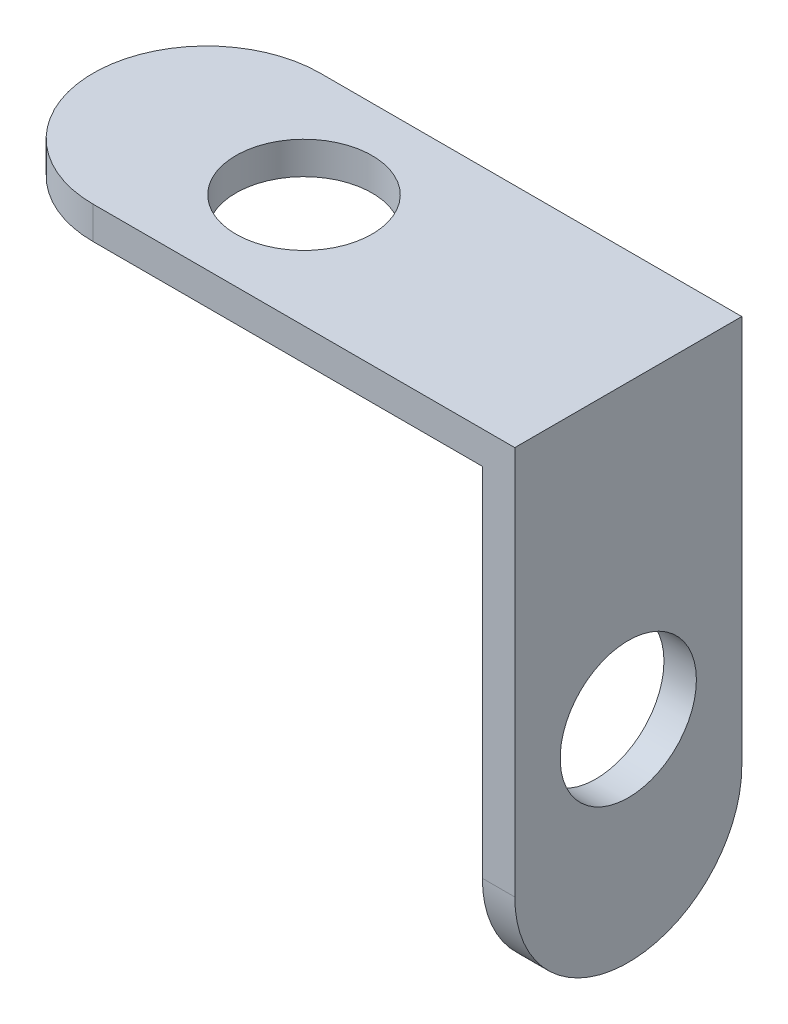
ISO-10303-21;
HEADER;
FILE_DESCRIPTION(('STEP AP214'),'2;1');
FILE_NAME('part.step','',(''),(''),'','','');
FILE_SCHEMA(('AUTOMOTIVE_DESIGN { 1 0 10303 214 1 1 1 1 }'));
ENDSEC;
DATA;
#1=APPLICATION_CONTEXT('core data for automotive mechanical design processes');
#2=APPLICATION_PROTOCOL_DEFINITION('international standard','automotive_design',2000,#1);
#3=PRODUCT_CONTEXT('',#1,'mechanical');
#4=PRODUCT('Part','Part','',(#3));
#5=PRODUCT_RELATED_PRODUCT_CATEGORY('part','',(#4));
#6=PRODUCT_DEFINITION_FORMATION('','',#4);
#7=PRODUCT_DEFINITION_CONTEXT('part definition',#1,'design');
#8=PRODUCT_DEFINITION('design','',#6,#7);
#9=PRODUCT_DEFINITION_SHAPE('','',#8);
#10=(LENGTH_UNIT() NAMED_UNIT(*) SI_UNIT(.MILLI.,.METRE.));
#11=(NAMED_UNIT(*) PLANE_ANGLE_UNIT() SI_UNIT($,.RADIAN.));
#12=(NAMED_UNIT(*) SI_UNIT($,.STERADIAN.) SOLID_ANGLE_UNIT());
#13=UNCERTAINTY_MEASURE_WITH_UNIT(LENGTH_MEASURE(1.E-05),#10,'distance_accuracy_value','');
#14=(GEOMETRIC_REPRESENTATION_CONTEXT(3) GLOBAL_UNCERTAINTY_ASSIGNED_CONTEXT((#13)) GLOBAL_UNIT_ASSIGNED_CONTEXT((#10,
#11,#12)) REPRESENTATION_CONTEXT('',''));
#15=CARTESIAN_POINT('',(0.,0.,0.));
#16=DIRECTION('',(0.,0.,1.));
#17=DIRECTION('',(1.,0.,0.));
#18=AXIS2_PLACEMENT_3D('',#15,#16,#17);
#19=CARTESIAN_POINT('',(-2.66159827333255,-0.911598273332554,3.49999999999999));
#20=DIRECTION('',(0.,1.,0.));
#21=DIRECTION('',(0.,0.,1.));
#22=AXIS2_PLACEMENT_3D('',#19,#20,#21);
#23=PLANE('',#22);
#24=DIRECTION('',(1.,0.,0.));
#25=VECTOR('',#24,1.);
#26=CARTESIAN_POINT('',(0.838401726667447,-0.911598273332554,5.24999999999999));
#27=LINE('',#26,#25);
#28=CARTESIAN_POINT('',(-2.66159827333255,-0.911598273332554,5.24999999999999));
#29=VERTEX_POINT('',#28);
#30=CARTESIAN_POINT('',(3.83840172666745,-0.911598273332561,5.24999999999999));
#31=VERTEX_POINT('',#30);
#32=EDGE_CURVE('E75',#29,#31,#27,.T.);
#33=ORIENTED_EDGE('',*,*,#32,.T.);
#34=DIRECTION('',(0.,0.,1.));
#35=VECTOR('',#34,1.);
#36=CARTESIAN_POINT('',(3.83840172666745,-0.911598273332548,1.74999999999999));
#37=LINE('',#36,#35);
#38=CARTESIAN_POINT('',(3.83840172666745,-0.911598273332548,1.74999999999999));
#39=VERTEX_POINT('',#38);
#40=EDGE_CURVE('E135',#39,#31,#37,.T.);
#41=ORIENTED_EDGE('',*,*,#40,.F.);
#42=DIRECTION('',(1.,0.,0.));
#43=VECTOR('',#42,1.);
#44=CARTESIAN_POINT('',(0.838401726667447,-0.911598273332554,1.74999999999999));
#45=LINE('',#44,#43);
#46=CARTESIAN_POINT('',(-2.66159827333255,-0.911598273332554,1.74999999999999));
#47=VERTEX_POINT('',#46);
#48=EDGE_CURVE('E112',#47,#39,#45,.T.);
#49=ORIENTED_EDGE('',*,*,#48,.F.);
#50=CARTESIAN_POINT('',(-2.66159827333255,-0.911598273332554,3.49999999999999));
#51=DIRECTION('',(0.,1.,0.));
#52=DIRECTION('',(0.,0.,1.));
#53=AXIS2_PLACEMENT_3D('',#50,#51,#52);
#54=CIRCLE('',#53,1.75);
#55=EDGE_CURVE('E101',#47,#29,#54,.T.);
#56=ORIENTED_EDGE('',*,*,#55,.T.);
#57=EDGE_LOOP('',(#33,#41,#49,#56));
#58=FACE_BOUND('',#57,.T.);
#59=CARTESIAN_POINT('',(-1.16159827333255,-0.911598273332554,3.49999999999999));
#60=DIRECTION('',(0.,1.,0.));
#61=DIRECTION('',(0.,0.,1.));
#62=AXIS2_PLACEMENT_3D('',#59,#60,#61);
#63=CIRCLE('',#62,1.05);
#64=CARTESIAN_POINT('',(-1.16159827333255,-0.911598273332554,4.54999999999999));
#65=VERTEX_POINT('',#64);
#66=EDGE_CURVE('E117',#65,#65,#63,.T.);
#67=ORIENTED_EDGE('',*,*,#66,.F.);
#68=EDGE_LOOP('',(#67));
#69=FACE_BOUND('',#68,.T.);
#70=ADVANCED_FACE('F58',(#58,#69),#23,.T.);
#71=CARTESIAN_POINT('',(-2.66159827333255,-1.41159827333255,3.49999999999999));
#72=DIRECTION('',(0.,1.,0.));
#73=DIRECTION('',(0.,0.,1.));
#74=AXIS2_PLACEMENT_3D('',#71,#72,#73);
#75=PLANE('',#74);
#76=DIRECTION('',(0.,0.,1.));
#77=VECTOR('',#76,1.);
#78=CARTESIAN_POINT('',(3.33840172666745,-1.41159827333255,1.74999999999999));
#79=LINE('',#78,#77);
#80=CARTESIAN_POINT('',(3.33840172666745,-1.41159827333255,1.74999999999999));
#81=VERTEX_POINT('',#80);
#82=CARTESIAN_POINT('',(3.33840172666745,-1.41159827333255,5.24999999999999));
#83=VERTEX_POINT('',#82);
#84=EDGE_CURVE('E110',#81,#83,#79,.T.);
#85=ORIENTED_EDGE('',*,*,#84,.T.);
#86=DIRECTION('',(-1.,0.,0.));
#87=VECTOR('',#86,1.);
#88=CARTESIAN_POINT('',(0.838401726667447,-1.41159827333255,5.24999999999999));
#89=LINE('',#88,#87);
#90=CARTESIAN_POINT('',(-2.66159827333255,-1.41159827333255,5.24999999999999));
#91=VERTEX_POINT('',#90);
#92=EDGE_CURVE('E97',#83,#91,#89,.T.);
#93=ORIENTED_EDGE('',*,*,#92,.T.);
#94=CARTESIAN_POINT('',(-2.66159827333255,-1.41159827333255,3.49999999999999));
#95=DIRECTION('',(0.,1.,0.));
#96=DIRECTION('',(0.,0.,1.));
#97=AXIS2_PLACEMENT_3D('',#94,#95,#96);
#98=CIRCLE('',#97,1.75);
#99=CARTESIAN_POINT('',(-2.66159827333255,-1.41159827333255,1.74999999999999));
#100=VERTEX_POINT('',#99);
#101=EDGE_CURVE('E103',#100,#91,#98,.T.);
#102=ORIENTED_EDGE('',*,*,#101,.F.);
#103=DIRECTION('',(-1.,0.,0.));
#104=VECTOR('',#103,1.);
#105=CARTESIAN_POINT('',(0.838401726667447,-1.41159827333255,1.74999999999999));
#106=LINE('',#105,#104);
#107=EDGE_CURVE('E90',#81,#100,#106,.T.);
#108=ORIENTED_EDGE('',*,*,#107,.F.);
#109=EDGE_LOOP('',(#85,#93,#102,#108));
#110=FACE_BOUND('',#109,.T.);
#111=CARTESIAN_POINT('',(-1.16159827333255,-1.41159827333255,3.49999999999999));
#112=DIRECTION('',(0.,1.,0.));
#113=DIRECTION('',(0.,0.,1.));
#114=AXIS2_PLACEMENT_3D('',#111,#112,#113);
#115=CIRCLE('',#114,1.05);
#116=CARTESIAN_POINT('',(-1.16159827333255,-1.41159827333255,4.54999999999999));
#117=VERTEX_POINT('',#116);
#118=EDGE_CURVE('E121',#117,#117,#115,.T.);
#119=ORIENTED_EDGE('',*,*,#118,.T.);
#120=EDGE_LOOP('',(#119));
#121=FACE_BOUND('',#120,.T.);
#122=ADVANCED_FACE('F107',(#110,#121),#75,.F.);
#123=CARTESIAN_POINT('',(0.838401726667447,-0.911598273332554,1.74999999999999));
#124=DIRECTION('',(0.,0.,1.));
#125=DIRECTION('',(1.,0.,0.));
#126=AXIS2_PLACEMENT_3D('',#123,#124,#125);
#127=PLANE('',#126);
#128=ORIENTED_EDGE('',*,*,#107,.T.);
#129=DIRECTION('',(0.,-1.,0.));
#130=VECTOR('',#129,1.);
#131=CARTESIAN_POINT('',(-2.66159827333255,-0.911598273332554,1.74999999999999));
#132=LINE('',#131,#130);
#133=EDGE_CURVE('E12',#47,#100,#132,.T.);
#134=ORIENTED_EDGE('',*,*,#133,.F.);
#135=ORIENTED_EDGE('',*,*,#48,.T.);
#136=DIRECTION('',(0.,1.,0.));
#137=VECTOR('',#136,1.);
#138=CARTESIAN_POINT('',(3.83840172666745,-6.91159827333255,1.74999999999997));
#139=LINE('',#138,#137);
#140=CARTESIAN_POINT('',(3.83840172666745,-6.91159827333255,1.74999999999997));
#141=VERTEX_POINT('',#140);
#142=EDGE_CURVE('E132',#141,#39,#139,.T.);
#143=ORIENTED_EDGE('',*,*,#142,.F.);
#144=DIRECTION('',(-1.,0.,0.));
#145=VECTOR('',#144,1.);
#146=CARTESIAN_POINT('',(3.83840172666745,-6.91159827333255,1.74999999999997));
#147=LINE('',#146,#145);
#148=CARTESIAN_POINT('',(3.33840172666745,-6.91159827333255,1.74999999999997));
#149=VERTEX_POINT('',#148);
#150=EDGE_CURVE('E129',#141,#149,#147,.T.);
#151=ORIENTED_EDGE('',*,*,#150,.T.);
#152=DIRECTION('',(0.,1.,0.));
#153=VECTOR('',#152,1.);
#154=CARTESIAN_POINT('',(3.33840172666745,-6.91159827333255,1.74999999999997));
#155=LINE('',#154,#153);
#156=EDGE_CURVE('E133',#149,#81,#155,.T.);
#157=ORIENTED_EDGE('',*,*,#156,.T.);
#158=EDGE_LOOP('',(#128,#134,#135,#143,#151,#157));
#159=FACE_BOUND('',#158,.T.);
#160=ADVANCED_FACE('F60',(#159),#127,.F.);
#161=CARTESIAN_POINT('',(-2.66159827333255,-0.911598273332554,3.49999999999999));
#162=DIRECTION('',(0.,-1.,0.));
#163=DIRECTION('',(0.,0.,-1.));
#164=AXIS2_PLACEMENT_3D('',#161,#162,#163);
#165=CYLINDRICAL_SURFACE('',#164,1.75);
#166=ORIENTED_EDGE('',*,*,#101,.T.);
#167=DIRECTION('',(0.,-1.,0.));
#168=VECTOR('',#167,1.);
#169=CARTESIAN_POINT('',(-2.66159827333255,-0.911598273332554,5.24999999999999));
#170=LINE('',#169,#168);
#171=EDGE_CURVE('E67',#29,#91,#170,.T.);
#172=ORIENTED_EDGE('',*,*,#171,.F.);
#173=ORIENTED_EDGE('',*,*,#55,.F.);
#174=ORIENTED_EDGE('',*,*,#133,.T.);
#175=EDGE_LOOP('',(#166,#172,#173,#174));
#176=FACE_BOUND('',#175,.T.);
#177=ADVANCED_FACE('F104',(#176),#165,.T.);
#178=CARTESIAN_POINT('',(0.838401726667447,-0.911598273332554,5.24999999999999));
#179=DIRECTION('',(0.,0.,1.));
#180=DIRECTION('',(1.,0.,0.));
#181=AXIS2_PLACEMENT_3D('',#178,#179,#180);
#182=PLANE('',#181);
#183=ORIENTED_EDGE('',*,*,#92,.F.);
#184=DIRECTION('',(0.,-1.,0.));
#185=VECTOR('',#184,1.);
#186=CARTESIAN_POINT('',(3.33840172666745,-6.91159827333256,5.24999999999997));
#187=LINE('',#186,#185);
#188=CARTESIAN_POINT('',(3.33840172666745,-6.91159827333256,5.24999999999997));
#189=VERTEX_POINT('',#188);
#190=EDGE_CURVE('E139',#83,#189,#187,.T.);
#191=ORIENTED_EDGE('',*,*,#190,.T.);
#192=DIRECTION('',(-1.,0.,0.));
#193=VECTOR('',#192,1.);
#194=CARTESIAN_POINT('',(3.83840172666745,-6.91159827333256,5.24999999999997));
#195=LINE('',#194,#193);
#196=CARTESIAN_POINT('',(3.83840172666745,-6.91159827333256,5.24999999999997));
#197=VERTEX_POINT('',#196);
#198=EDGE_CURVE('E124',#197,#189,#195,.T.);
#199=ORIENTED_EDGE('',*,*,#198,.F.);
#200=DIRECTION('',(0.,-1.,0.));
#201=VECTOR('',#200,1.);
#202=CARTESIAN_POINT('',(3.83840172666745,-6.91159827333256,5.24999999999997));
#203=LINE('',#202,#201);
#204=EDGE_CURVE('E147',#31,#197,#203,.T.);
#205=ORIENTED_EDGE('',*,*,#204,.F.);
#206=ORIENTED_EDGE('',*,*,#32,.F.);
#207=ORIENTED_EDGE('',*,*,#171,.T.);
#208=EDGE_LOOP('',(#183,#191,#199,#205,#206,#207));
#209=FACE_BOUND('',#208,.T.);
#210=ADVANCED_FACE('F94',(#209),#182,.T.);
#211=CARTESIAN_POINT('',(-1.16159827333255,-0.911598273332554,3.49999999999999));
#212=DIRECTION('',(0.,-1.,0.));
#213=DIRECTION('',(0.,0.,-1.));
#214=AXIS2_PLACEMENT_3D('',#211,#212,#213);
#215=CYLINDRICAL_SURFACE('',#214,1.05);
#216=ORIENTED_EDGE('',*,*,#66,.T.);
#217=EDGE_LOOP('',(#216));
#218=FACE_BOUND('',#217,.T.);
#219=ORIENTED_EDGE('',*,*,#118,.F.);
#220=EDGE_LOOP('',(#219));
#221=FACE_BOUND('',#220,.T.);
#222=ADVANCED_FACE('F164',(#218,#221),#215,.F.);
#223=CARTESIAN_POINT('',(3.83840172666745,-6.91159827333255,3.49999999999997));
#224=DIRECTION('',(1.,0.,0.));
#225=DIRECTION('',(0.,0.,-1.));
#226=AXIS2_PLACEMENT_3D('',#223,#224,#225);
#227=PLANE('',#226);
#228=ORIENTED_EDGE('',*,*,#40,.T.);
#229=ORIENTED_EDGE('',*,*,#204,.T.);
#230=CARTESIAN_POINT('',(3.83840172666745,-6.91159827333255,3.49999999999997));
#231=DIRECTION('',(1.,0.,0.));
#232=DIRECTION('',(0.,0.,-1.));
#233=AXIS2_PLACEMENT_3D('',#230,#231,#232);
#234=CIRCLE('',#233,1.75);
#235=EDGE_CURVE('E144',#197,#141,#234,.T.);
#236=ORIENTED_EDGE('',*,*,#235,.T.);
#237=ORIENTED_EDGE('',*,*,#142,.T.);
#238=EDGE_LOOP('',(#228,#229,#236,#237));
#239=FACE_BOUND('',#238,.T.);
#240=CARTESIAN_POINT('',(3.83840172666745,-5.41159827333255,3.49999999999998));
#241=DIRECTION('',(1.,0.,0.));
#242=DIRECTION('',(0.,0.,-1.));
#243=AXIS2_PLACEMENT_3D('',#240,#241,#242);
#244=CIRCLE('',#243,1.05);
#245=CARTESIAN_POINT('',(3.83840172666745,-5.41159827333255,2.44999999999998));
#246=VERTEX_POINT('',#245);
#247=EDGE_CURVE('E141',#246,#246,#244,.T.);
#248=ORIENTED_EDGE('',*,*,#247,.F.);
#249=EDGE_LOOP('',(#248));
#250=FACE_BOUND('',#249,.T.);
#251=ADVANCED_FACE('F161',(#239,#250),#227,.T.);
#252=CARTESIAN_POINT('',(3.33840172666745,-6.91159827333255,3.49999999999997));
#253=DIRECTION('',(1.,0.,0.));
#254=DIRECTION('',(0.,0.,-1.));
#255=AXIS2_PLACEMENT_3D('',#252,#253,#254);
#256=PLANE('',#255);
#257=ORIENTED_EDGE('',*,*,#84,.F.);
#258=ORIENTED_EDGE('',*,*,#156,.F.);
#259=CARTESIAN_POINT('',(3.33840172666745,-6.91159827333255,3.49999999999997));
#260=DIRECTION('',(1.,0.,0.));
#261=DIRECTION('',(0.,0.,-1.));
#262=AXIS2_PLACEMENT_3D('',#259,#260,#261);
#263=CIRCLE('',#262,1.75);
#264=EDGE_CURVE('E136',#189,#149,#263,.T.);
#265=ORIENTED_EDGE('',*,*,#264,.F.);
#266=ORIENTED_EDGE('',*,*,#190,.F.);
#267=EDGE_LOOP('',(#257,#258,#265,#266));
#268=FACE_BOUND('',#267,.T.);
#269=CARTESIAN_POINT('',(3.33840172666745,-5.41159827333255,3.49999999999998));
#270=DIRECTION('',(1.,0.,0.));
#271=DIRECTION('',(0.,0.,-1.));
#272=AXIS2_PLACEMENT_3D('',#269,#270,#271);
#273=CIRCLE('',#272,1.05);
#274=CARTESIAN_POINT('',(3.33840172666745,-5.41159827333255,2.44999999999998));
#275=VERTEX_POINT('',#274);
#276=EDGE_CURVE('E152',#275,#275,#273,.T.);
#277=ORIENTED_EDGE('',*,*,#276,.T.);
#278=EDGE_LOOP('',(#277));
#279=FACE_BOUND('',#278,.T.);
#280=ADVANCED_FACE('F163',(#268,#279),#256,.F.);
#281=CARTESIAN_POINT('',(3.83840172666745,-6.91159827333255,3.49999999999997));
#282=DIRECTION('',(-1.,0.,0.));
#283=DIRECTION('',(0.,0.,1.));
#284=AXIS2_PLACEMENT_3D('',#281,#282,#283);
#285=CYLINDRICAL_SURFACE('',#284,1.75);
#286=ORIENTED_EDGE('',*,*,#264,.T.);
#287=ORIENTED_EDGE('',*,*,#150,.F.);
#288=ORIENTED_EDGE('',*,*,#235,.F.);
#289=ORIENTED_EDGE('',*,*,#198,.T.);
#290=EDGE_LOOP('',(#286,#287,#288,#289));
#291=FACE_BOUND('',#290,.T.);
#292=ADVANCED_FACE('F171',(#291),#285,.T.);
#293=CARTESIAN_POINT('',(3.83840172666745,-5.41159827333255,3.49999999999998));
#294=DIRECTION('',(-1.,0.,0.));
#295=DIRECTION('',(0.,0.,1.));
#296=AXIS2_PLACEMENT_3D('',#293,#294,#295);
#297=CYLINDRICAL_SURFACE('',#296,1.05);
#298=ORIENTED_EDGE('',*,*,#247,.T.);
#299=EDGE_LOOP('',(#298));
#300=FACE_BOUND('',#299,.T.);
#301=ORIENTED_EDGE('',*,*,#276,.F.);
#302=EDGE_LOOP('',(#301));
#303=FACE_BOUND('',#302,.T.);
#304=ADVANCED_FACE('F158',(#300,#303),#297,.F.);
#305=CLOSED_SHELL('',(#70,#122,#160,#177,#210,#222,#251,#280,#292,#304));
#306=MANIFOLD_SOLID_BREP('B2',#305);
#307=ADVANCED_BREP_SHAPE_REPRESENTATION('',(#18,#306),#14);
#308=SHAPE_DEFINITION_REPRESENTATION(#9,#307);
ENDSEC;
END-ISO-10303-21;
